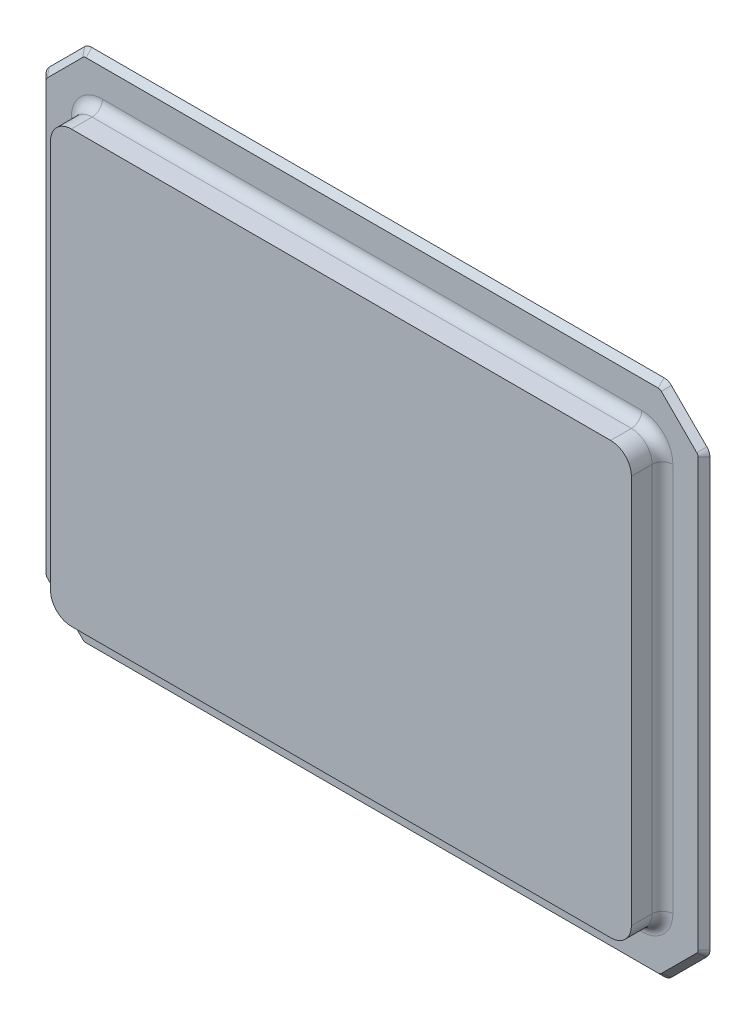
ISO-10303-21;
HEADER;
FILE_DESCRIPTION(('STEP AP214'),'2;1');
FILE_NAME('part.step','',(''),(''),'','','');
FILE_SCHEMA(('AUTOMOTIVE_DESIGN { 1 0 10303 214 1 1 1 1 }'));
ENDSEC;
DATA;
#1=APPLICATION_CONTEXT('core data for automotive mechanical design processes');
#2=APPLICATION_PROTOCOL_DEFINITION('international standard','automotive_design',2000,#1);
#3=PRODUCT_CONTEXT('',#1,'mechanical');
#4=PRODUCT('Part','Part','',(#3));
#5=PRODUCT_RELATED_PRODUCT_CATEGORY('part','',(#4));
#6=PRODUCT_DEFINITION_FORMATION('','',#4);
#7=PRODUCT_DEFINITION_CONTEXT('part definition',#1,'design');
#8=PRODUCT_DEFINITION('design','',#6,#7);
#9=PRODUCT_DEFINITION_SHAPE('','',#8);
#10=(LENGTH_UNIT() NAMED_UNIT(*) SI_UNIT(.MILLI.,.METRE.));
#11=(NAMED_UNIT(*) PLANE_ANGLE_UNIT() SI_UNIT($,.RADIAN.));
#12=(NAMED_UNIT(*) SI_UNIT($,.STERADIAN.) SOLID_ANGLE_UNIT());
#13=UNCERTAINTY_MEASURE_WITH_UNIT(LENGTH_MEASURE(1.E-05),#10,'distance_accuracy_value','');
#14=(GEOMETRIC_REPRESENTATION_CONTEXT(3) GLOBAL_UNCERTAINTY_ASSIGNED_CONTEXT((#13)) GLOBAL_UNIT_ASSIGNED_CONTEXT((#10,
#11,#12)) REPRESENTATION_CONTEXT('',''));
#15=CARTESIAN_POINT('',(0.,0.,0.));
#16=DIRECTION('',(0.,0.,1.));
#17=DIRECTION('',(1.,0.,0.));
#18=AXIS2_PLACEMENT_3D('',#15,#16,#17);
#19=CARTESIAN_POINT('',(1.3,-0.938189666446,0.7));
#20=DIRECTION('',(0.,0.,-1.));
#21=DIRECTION('',(0.707106781186548,-0.707106781186548,0.));
#22=AXIS2_PLACEMENT_3D('',#19,#20,#21);
#23=CYLINDRICAL_SURFACE('',#22,0.1);
#24=CARTESIAN_POINT('',(1.3,-0.938189666446,0.55));
#25=DIRECTION('',(0.,0.,-1.));
#26=DIRECTION('',(0.707106781186548,-0.707106781186548,0.));
#27=AXIS2_PLACEMENT_3D('',#24,#25,#26);
#28=CIRCLE('',#27,0.1);
#29=CARTESIAN_POINT('',(1.4,-0.938189666446,0.55));
#30=VERTEX_POINT('',#29);
#31=CARTESIAN_POINT('',(1.3,-1.038189666446,0.55));
#32=VERTEX_POINT('',#31);
#33=EDGE_CURVE('E452',#30,#32,#28,.T.);
#34=ORIENTED_EDGE('',*,*,#33,.F.);
#35=DIRECTION('',(0.,0.,1.));
#36=VECTOR('',#35,1.);
#37=CARTESIAN_POINT('',(1.4,-0.938189666446,0.7));
#38=LINE('',#37,#36);
#39=CARTESIAN_POINT('',(1.4,-0.938189666446,0.65));
#40=VERTEX_POINT('',#39);
#41=EDGE_CURVE('E334',#30,#40,#38,.T.);
#42=ORIENTED_EDGE('',*,*,#41,.T.);
#43=CARTESIAN_POINT('',(1.3,-0.938189666446,0.65));
#44=DIRECTION('',(0.,0.,1.));
#45=DIRECTION('',(0.707106781186548,-0.707106781186548,0.));
#46=AXIS2_PLACEMENT_3D('',#43,#44,#45);
#47=CIRCLE('',#46,0.1);
#48=CARTESIAN_POINT('',(1.3,-1.038189666446,0.65));
#49=VERTEX_POINT('',#48);
#50=EDGE_CURVE('E437',#49,#40,#47,.T.);
#51=ORIENTED_EDGE('',*,*,#50,.F.);
#52=DIRECTION('',(0.,0.,-1.));
#53=VECTOR('',#52,1.);
#54=CARTESIAN_POINT('',(1.3,-1.038189666446,0.7));
#55=LINE('',#54,#53);
#56=EDGE_CURVE('E20',#49,#32,#55,.T.);
#57=ORIENTED_EDGE('',*,*,#56,.T.);
#58=EDGE_LOOP('',(#34,#42,#51,#57));
#59=FACE_BOUND('',#58,.T.);
#60=ADVANCED_FACE('F17',(#59),#23,.T.);
#61=CARTESIAN_POINT('',(-1.4,-1.038189666446,0.7));
#62=DIRECTION('',(-1.,0.,0.));
#63=DIRECTION('',(0.,0.,1.));
#64=AXIS2_PLACEMENT_3D('',#61,#62,#63);
#65=PLANE('',#64);
#66=DIRECTION('',(0.,1.,0.));
#67=VECTOR('',#66,1.);
#68=CARTESIAN_POINT('',(-1.4,-0.519094833223,0.55));
#69=LINE('',#68,#67);
#70=CARTESIAN_POINT('',(-1.4,-0.938189666446,0.55));
#71=VERTEX_POINT('',#70);
#72=CARTESIAN_POINT('',(-1.4,0.938189666446,0.55));
#73=VERTEX_POINT('',#72);
#74=EDGE_CURVE('E322',#71,#73,#69,.T.);
#75=ORIENTED_EDGE('',*,*,#74,.F.);
#76=DIRECTION('',(0.,0.,-1.));
#77=VECTOR('',#76,1.);
#78=CARTESIAN_POINT('',(-1.4,-0.938189666446,0.7));
#79=LINE('',#78,#77);
#80=CARTESIAN_POINT('',(-1.4,-0.938189666446,0.65));
#81=VERTEX_POINT('',#80);
#82=EDGE_CURVE('E11',#81,#71,#79,.T.);
#83=ORIENTED_EDGE('',*,*,#82,.F.);
#84=DIRECTION('',(0.,-1.,0.));
#85=VECTOR('',#84,1.);
#86=CARTESIAN_POINT('',(-1.4,-0.519094833223,0.65));
#87=LINE('',#86,#85);
#88=CARTESIAN_POINT('',(-1.4,0.938189666446,0.65));
#89=VERTEX_POINT('',#88);
#90=EDGE_CURVE('E416',#89,#81,#87,.T.);
#91=ORIENTED_EDGE('',*,*,#90,.F.);
#92=DIRECTION('',(0.,0.,1.));
#93=VECTOR('',#92,1.);
#94=CARTESIAN_POINT('',(-1.4,0.938189666446,0.7));
#95=LINE('',#94,#93);
#96=EDGE_CURVE('E479',#73,#89,#95,.T.);
#97=ORIENTED_EDGE('',*,*,#96,.F.);
#98=EDGE_LOOP('',(#75,#83,#91,#97));
#99=FACE_BOUND('',#98,.T.);
#100=ADVANCED_FACE('F602',(#99),#65,.T.);
#101=CARTESIAN_POINT('',(-1.3,-0.938189666446,0.7));
#102=DIRECTION('',(0.,0.,-1.));
#103=DIRECTION('',(-0.707106781186548,-0.707106781186548,0.));
#104=AXIS2_PLACEMENT_3D('',#101,#102,#103);
#105=CYLINDRICAL_SURFACE('',#104,0.1);
#106=CARTESIAN_POINT('',(-1.3,-0.938189666446,0.55));
#107=DIRECTION('',(0.,0.,-1.));
#108=DIRECTION('',(-0.707106781186548,-0.707106781186548,0.));
#109=AXIS2_PLACEMENT_3D('',#106,#107,#108);
#110=CIRCLE('',#109,0.1);
#111=CARTESIAN_POINT('',(-1.3,-1.038189666446,0.55));
#112=VERTEX_POINT('',#111);
#113=EDGE_CURVE('E321',#112,#71,#110,.T.);
#114=ORIENTED_EDGE('',*,*,#113,.F.);
#115=DIRECTION('',(0.,0.,1.));
#116=VECTOR('',#115,1.);
#117=CARTESIAN_POINT('',(-1.3,-1.038189666446,0.7));
#118=LINE('',#117,#116);
#119=CARTESIAN_POINT('',(-1.3,-1.038189666446,0.65));
#120=VERTEX_POINT('',#119);
#121=EDGE_CURVE('E26',#112,#120,#118,.T.);
#122=ORIENTED_EDGE('',*,*,#121,.T.);
#123=CARTESIAN_POINT('',(-1.3,-0.938189666446,0.65));
#124=DIRECTION('',(0.,0.,1.));
#125=DIRECTION('',(-0.707106781186548,-0.707106781186548,0.));
#126=AXIS2_PLACEMENT_3D('',#123,#124,#125);
#127=CIRCLE('',#126,0.1);
#128=EDGE_CURVE('E420',#81,#120,#127,.T.);
#129=ORIENTED_EDGE('',*,*,#128,.F.);
#130=ORIENTED_EDGE('',*,*,#82,.T.);
#131=EDGE_LOOP('',(#114,#122,#129,#130));
#132=FACE_BOUND('',#131,.T.);
#133=ADVANCED_FACE('F627',(#132),#105,.T.);
#134=CARTESIAN_POINT('',(1.4,-1.038189666446,0.7));
#135=DIRECTION('',(0.,-1.,0.));
#136=DIRECTION('',(0.,0.,-1.));
#137=AXIS2_PLACEMENT_3D('',#134,#135,#136);
#138=PLANE('',#137);
#139=DIRECTION('',(-1.,0.,0.));
#140=VECTOR('',#139,1.);
#141=CARTESIAN_POINT('',(0.7,-1.038189666446,0.55));
#142=LINE('',#141,#140);
#143=EDGE_CURVE('E504',#32,#112,#142,.T.);
#144=ORIENTED_EDGE('',*,*,#143,.F.);
#145=ORIENTED_EDGE('',*,*,#56,.F.);
#146=DIRECTION('',(1.,0.,0.));
#147=VECTOR('',#146,1.);
#148=CARTESIAN_POINT('',(0.7,-1.038189666446,0.65));
#149=LINE('',#148,#147);
#150=EDGE_CURVE('E429',#120,#49,#149,.T.);
#151=ORIENTED_EDGE('',*,*,#150,.F.);
#152=ORIENTED_EDGE('',*,*,#121,.F.);
#153=EDGE_LOOP('',(#144,#145,#151,#152));
#154=FACE_BOUND('',#153,.T.);
#155=ADVANCED_FACE('F631',(#154),#138,.T.);
#156=CARTESIAN_POINT('',(-1.3,0.938189666446,0.7));
#157=DIRECTION('',(0.,0.,-1.));
#158=DIRECTION('',(-0.707106781186548,0.707106781186548,0.));
#159=AXIS2_PLACEMENT_3D('',#156,#157,#158);
#160=CYLINDRICAL_SURFACE('',#159,0.1);
#161=CARTESIAN_POINT('',(-1.3,0.938189666446,0.55));
#162=DIRECTION('',(0.,0.,-1.));
#163=DIRECTION('',(-0.707106781186548,0.707106781186548,0.));
#164=AXIS2_PLACEMENT_3D('',#161,#162,#163);
#165=CIRCLE('',#164,0.1);
#166=CARTESIAN_POINT('',(-1.3,1.038189666446,0.55));
#167=VERTEX_POINT('',#166);
#168=EDGE_CURVE('E398',#73,#167,#165,.T.);
#169=ORIENTED_EDGE('',*,*,#168,.F.);
#170=ORIENTED_EDGE('',*,*,#96,.T.);
#171=CARTESIAN_POINT('',(-1.3,0.938189666446,0.65));
#172=DIRECTION('',(0.,0.,1.));
#173=DIRECTION('',(-0.707106781186548,0.707106781186548,0.));
#174=AXIS2_PLACEMENT_3D('',#171,#172,#173);
#175=CIRCLE('',#174,0.1);
#176=CARTESIAN_POINT('',(-1.3,1.038189666446,0.65));
#177=VERTEX_POINT('',#176);
#178=EDGE_CURVE('E397',#177,#89,#175,.T.);
#179=ORIENTED_EDGE('',*,*,#178,.F.);
#180=DIRECTION('',(0.,0.,-1.));
#181=VECTOR('',#180,1.);
#182=CARTESIAN_POINT('',(-1.3,1.038189666446,0.7));
#183=LINE('',#182,#181);
#184=EDGE_CURVE('E482',#177,#167,#183,.T.);
#185=ORIENTED_EDGE('',*,*,#184,.T.);
#186=EDGE_LOOP('',(#169,#170,#179,#185));
#187=FACE_BOUND('',#186,.T.);
#188=ADVANCED_FACE('F582',(#187),#160,.T.);
#189=CARTESIAN_POINT('',(-1.4,1.038189666446,0.7));
#190=DIRECTION('',(0.,1.,0.));
#191=DIRECTION('',(1.,0.,0.));
#192=AXIS2_PLACEMENT_3D('',#189,#190,#191);
#193=PLANE('',#192);
#194=DIRECTION('',(1.,0.,0.));
#195=VECTOR('',#194,1.);
#196=CARTESIAN_POINT('',(-0.7,1.038189666446,0.55));
#197=LINE('',#196,#195);
#198=CARTESIAN_POINT('',(1.3,1.038189666446,0.55));
#199=VERTEX_POINT('',#198);
#200=EDGE_CURVE('E374',#167,#199,#197,.T.);
#201=ORIENTED_EDGE('',*,*,#200,.F.);
#202=ORIENTED_EDGE('',*,*,#184,.F.);
#203=DIRECTION('',(-1.,0.,0.));
#204=VECTOR('',#203,1.);
#205=CARTESIAN_POINT('',(-0.7,1.038189666446,0.65));
#206=LINE('',#205,#204);
#207=CARTESIAN_POINT('',(1.3,1.038189666446,0.65));
#208=VERTEX_POINT('',#207);
#209=EDGE_CURVE('E393',#208,#177,#206,.T.);
#210=ORIENTED_EDGE('',*,*,#209,.F.);
#211=DIRECTION('',(0.,0.,1.));
#212=VECTOR('',#211,1.);
#213=CARTESIAN_POINT('',(1.3,1.038189666446,0.7));
#214=LINE('',#213,#212);
#215=EDGE_CURVE('E39',#199,#208,#214,.T.);
#216=ORIENTED_EDGE('',*,*,#215,.F.);
#217=EDGE_LOOP('',(#201,#202,#210,#216));
#218=FACE_BOUND('',#217,.T.);
#219=ADVANCED_FACE('F583',(#218),#193,.T.);
#220=CARTESIAN_POINT('',(1.3,0.938189666446,0.7));
#221=DIRECTION('',(0.,0.,-1.));
#222=DIRECTION('',(0.707106781186548,0.707106781186548,0.));
#223=AXIS2_PLACEMENT_3D('',#220,#221,#222);
#224=CYLINDRICAL_SURFACE('',#223,0.1);
#225=CARTESIAN_POINT('',(1.3,0.938189666446,0.55));
#226=DIRECTION('',(0.,0.,-1.));
#227=DIRECTION('',(0.707106781186548,0.707106781186548,0.));
#228=AXIS2_PLACEMENT_3D('',#225,#226,#227);
#229=CIRCLE('',#228,0.1);
#230=CARTESIAN_POINT('',(1.4,0.938189666446,0.55));
#231=VERTEX_POINT('',#230);
#232=EDGE_CURVE('E483',#199,#231,#229,.T.);
#233=ORIENTED_EDGE('',*,*,#232,.F.);
#234=ORIENTED_EDGE('',*,*,#215,.T.);
#235=CARTESIAN_POINT('',(1.3,0.938189666446,0.65));
#236=DIRECTION('',(0.,0.,1.));
#237=DIRECTION('',(0.707106781186548,0.707106781186548,0.));
#238=AXIS2_PLACEMENT_3D('',#235,#236,#237);
#239=CIRCLE('',#238,0.1);
#240=CARTESIAN_POINT('',(1.4,0.938189666446,0.65));
#241=VERTEX_POINT('',#240);
#242=EDGE_CURVE('E389',#241,#208,#239,.T.);
#243=ORIENTED_EDGE('',*,*,#242,.F.);
#244=DIRECTION('',(0.,0.,-1.));
#245=VECTOR('',#244,1.);
#246=CARTESIAN_POINT('',(1.4,0.938189666446,0.7));
#247=LINE('',#246,#245);
#248=EDGE_CURVE('E49',#241,#231,#247,.T.);
#249=ORIENTED_EDGE('',*,*,#248,.T.);
#250=EDGE_LOOP('',(#233,#234,#243,#249));
#251=FACE_BOUND('',#250,.T.);
#252=ADVANCED_FACE('F608',(#251),#224,.T.);
#253=CARTESIAN_POINT('',(1.4,1.038189666446,0.7));
#254=DIRECTION('',(1.,0.,0.));
#255=DIRECTION('',(0.,1.,0.));
#256=AXIS2_PLACEMENT_3D('',#253,#254,#255);
#257=PLANE('',#256);
#258=DIRECTION('',(0.,-1.,0.));
#259=VECTOR('',#258,1.);
#260=CARTESIAN_POINT('',(1.4,0.519094833223,0.55));
#261=LINE('',#260,#259);
#262=EDGE_CURVE('E451',#231,#30,#261,.T.);
#263=ORIENTED_EDGE('',*,*,#262,.F.);
#264=ORIENTED_EDGE('',*,*,#248,.F.);
#265=DIRECTION('',(0.,1.,0.));
#266=VECTOR('',#265,1.);
#267=CARTESIAN_POINT('',(1.4,0.519094833223,0.65));
#268=LINE('',#267,#266);
#269=EDGE_CURVE('E290',#40,#241,#268,.T.);
#270=ORIENTED_EDGE('',*,*,#269,.F.);
#271=ORIENTED_EDGE('',*,*,#41,.F.);
#272=EDGE_LOOP('',(#263,#264,#270,#271));
#273=FACE_BOUND('',#272,.T.);
#274=ADVANCED_FACE('F635',(#273),#257,.T.);
#275=CARTESIAN_POINT('',(-0.7,1.088189666446,0.55));
#276=DIRECTION('',(-1.,0.,0.));
#277=DIRECTION('',(0.,-0.707106781186548,-0.707106781186548));
#278=AXIS2_PLACEMENT_3D('',#275,#276,#277);
#279=CYLINDRICAL_SURFACE('',#278,0.05);
#280=CARTESIAN_POINT('',(-1.3,1.088189666446,0.55));
#281=DIRECTION('',(1.,0.,0.));
#282=DIRECTION('',(0.,-1.,0.));
#283=AXIS2_PLACEMENT_3D('',#280,#281,#282);
#284=CIRCLE('',#283,0.05);
#285=CARTESIAN_POINT('',(-1.3,1.088189666446,0.5));
#286=VERTEX_POINT('',#285);
#287=EDGE_CURVE('E351',#167,#286,#284,.T.);
#288=ORIENTED_EDGE('',*,*,#287,.F.);
#289=ORIENTED_EDGE('',*,*,#200,.T.);
#290=CARTESIAN_POINT('',(1.3,1.088189666446,0.55));
#291=DIRECTION('',(-1.,0.,0.));
#292=DIRECTION('',(0.,0.,-1.));
#293=AXIS2_PLACEMENT_3D('',#290,#291,#292);
#294=CIRCLE('',#293,0.05);
#295=CARTESIAN_POINT('',(1.3,1.088189666446,0.5));
#296=VERTEX_POINT('',#295);
#297=EDGE_CURVE('E486',#296,#199,#294,.T.);
#298=ORIENTED_EDGE('',*,*,#297,.F.);
#299=DIRECTION('',(-1.,0.,0.));
#300=VECTOR('',#299,1.);
#301=CARTESIAN_POINT('',(-0.7,1.088189666446,0.5));
#302=LINE('',#301,#300);
#303=EDGE_CURVE('E491',#296,#286,#302,.T.);
#304=ORIENTED_EDGE('',*,*,#303,.T.);
#305=EDGE_LOOP('',(#288,#289,#298,#304));
#306=FACE_BOUND('',#305,.T.);
#307=ADVANCED_FACE('F588',(#306),#279,.F.);
#308=CARTESIAN_POINT('',(1.3,0.938189666446,0.55));
#309=DIRECTION('',(0.,0.,1.));
#310=DIRECTION('',(1.,0.,0.));
#311=AXIS2_PLACEMENT_3D('',#308,#309,#310);
#312=TOROIDAL_SURFACE('',#311,0.15,0.05);
#313=ORIENTED_EDGE('',*,*,#297,.T.);
#314=ORIENTED_EDGE('',*,*,#232,.T.);
#315=CARTESIAN_POINT('',(1.45,0.938189666446,0.55));
#316=DIRECTION('',(0.,1.,0.));
#317=DIRECTION('',(0.,0.,-1.));
#318=AXIS2_PLACEMENT_3D('',#315,#316,#317);
#319=CIRCLE('',#318,0.05);
#320=CARTESIAN_POINT('',(1.45,0.938189666446,0.5));
#321=VERTEX_POINT('',#320);
#322=EDGE_CURVE('E447',#321,#231,#319,.T.);
#323=ORIENTED_EDGE('',*,*,#322,.F.);
#324=CARTESIAN_POINT('',(1.3,0.938189666446,0.5));
#325=DIRECTION('',(0.,0.,1.));
#326=DIRECTION('',(0.707106781186548,0.707106781186548,0.));
#327=AXIS2_PLACEMENT_3D('',#324,#325,#326);
#328=CIRCLE('',#327,0.15);
#329=EDGE_CURVE('E487',#321,#296,#328,.T.);
#330=ORIENTED_EDGE('',*,*,#329,.T.);
#331=EDGE_LOOP('',(#313,#314,#323,#330));
#332=FACE_BOUND('',#331,.T.);
#333=ADVANCED_FACE('F611',(#332),#312,.F.);
#334=CARTESIAN_POINT('',(1.45,0.519094833223,0.55));
#335=DIRECTION('',(0.,1.,0.));
#336=DIRECTION('',(-0.707106781186548,0.,-0.707106781186548));
#337=AXIS2_PLACEMENT_3D('',#334,#335,#336);
#338=CYLINDRICAL_SURFACE('',#337,0.05);
#339=ORIENTED_EDGE('',*,*,#322,.T.);
#340=ORIENTED_EDGE('',*,*,#262,.T.);
#341=CARTESIAN_POINT('',(1.45,-0.938189666446,0.55));
#342=DIRECTION('',(0.,1.,0.));
#343=DIRECTION('',(0.,0.,-1.));
#344=AXIS2_PLACEMENT_3D('',#341,#342,#343);
#345=CIRCLE('',#344,0.05);
#346=CARTESIAN_POINT('',(1.45,-0.938189666446,0.5));
#347=VERTEX_POINT('',#346);
#348=EDGE_CURVE('E525',#347,#30,#345,.T.);
#349=ORIENTED_EDGE('',*,*,#348,.F.);
#350=DIRECTION('',(0.,1.,0.));
#351=VECTOR('',#350,1.);
#352=CARTESIAN_POINT('',(1.45,0.519094833223,0.5));
#353=LINE('',#352,#351);
#354=EDGE_CURVE('E328',#347,#321,#353,.T.);
#355=ORIENTED_EDGE('',*,*,#354,.T.);
#356=EDGE_LOOP('',(#339,#340,#349,#355));
#357=FACE_BOUND('',#356,.T.);
#358=ADVANCED_FACE('F615',(#357),#338,.F.);
#359=CARTESIAN_POINT('',(1.3,-0.938189666446,0.55));
#360=DIRECTION('',(0.,0.,1.));
#361=DIRECTION('',(1.,0.,0.));
#362=AXIS2_PLACEMENT_3D('',#359,#360,#361);
#363=TOROIDAL_SURFACE('',#362,0.15,0.05);
#364=ORIENTED_EDGE('',*,*,#348,.T.);
#365=ORIENTED_EDGE('',*,*,#33,.T.);
#366=CARTESIAN_POINT('',(1.3,-1.088189666446,0.55));
#367=DIRECTION('',(1.,0.,0.));
#368=DIRECTION('',(0.,0.,-1.));
#369=AXIS2_PLACEMENT_3D('',#366,#367,#368);
#370=CIRCLE('',#369,0.05);
#371=CARTESIAN_POINT('',(1.3,-1.088189666446,0.5));
#372=VERTEX_POINT('',#371);
#373=EDGE_CURVE('E350',#372,#32,#370,.T.);
#374=ORIENTED_EDGE('',*,*,#373,.F.);
#375=CARTESIAN_POINT('',(1.3,-0.938189666446,0.5));
#376=DIRECTION('',(0.,0.,1.));
#377=DIRECTION('',(0.707106781186548,-0.707106781186548,0.));
#378=AXIS2_PLACEMENT_3D('',#375,#376,#377);
#379=CIRCLE('',#378,0.15);
#380=EDGE_CURVE('E323',#372,#347,#379,.T.);
#381=ORIENTED_EDGE('',*,*,#380,.T.);
#382=EDGE_LOOP('',(#364,#365,#374,#381));
#383=FACE_BOUND('',#382,.T.);
#384=ADVANCED_FACE('F619',(#383),#363,.F.);
#385=CARTESIAN_POINT('',(0.7,-1.088189666446,0.55));
#386=DIRECTION('',(1.,0.,0.));
#387=DIRECTION('',(0.,0.707106781186548,-0.707106781186548));
#388=AXIS2_PLACEMENT_3D('',#385,#386,#387);
#389=CYLINDRICAL_SURFACE('',#388,0.05);
#390=ORIENTED_EDGE('',*,*,#373,.T.);
#391=ORIENTED_EDGE('',*,*,#143,.T.);
#392=CARTESIAN_POINT('',(-1.3,-1.088189666446,0.55));
#393=DIRECTION('',(1.,0.,0.));
#394=DIRECTION('',(0.,0.,-1.));
#395=AXIS2_PLACEMENT_3D('',#392,#393,#394);
#396=CIRCLE('',#395,0.05);
#397=CARTESIAN_POINT('',(-1.3,-1.088189666446,0.5));
#398=VERTEX_POINT('',#397);
#399=EDGE_CURVE('E317',#398,#112,#396,.T.);
#400=ORIENTED_EDGE('',*,*,#399,.F.);
#401=DIRECTION('',(1.,0.,0.));
#402=VECTOR('',#401,1.);
#403=CARTESIAN_POINT('',(0.7,-1.088189666446,0.5));
#404=LINE('',#403,#402);
#405=EDGE_CURVE('E327',#398,#372,#404,.T.);
#406=ORIENTED_EDGE('',*,*,#405,.T.);
#407=EDGE_LOOP('',(#390,#391,#400,#406));
#408=FACE_BOUND('',#407,.T.);
#409=ADVANCED_FACE('F622',(#408),#389,.F.);
#410=CARTESIAN_POINT('',(-1.3,-0.938189666446,0.55));
#411=DIRECTION('',(0.,0.,1.));
#412=DIRECTION('',(1.,0.,0.));
#413=AXIS2_PLACEMENT_3D('',#410,#411,#412);
#414=TOROIDAL_SURFACE('',#413,0.15,0.05);
#415=ORIENTED_EDGE('',*,*,#399,.T.);
#416=ORIENTED_EDGE('',*,*,#113,.T.);
#417=CARTESIAN_POINT('',(-1.45,-0.938189666446,0.55));
#418=DIRECTION('',(0.,-1.,0.));
#419=DIRECTION('',(0.,0.,-1.));
#420=AXIS2_PLACEMENT_3D('',#417,#418,#419);
#421=CIRCLE('',#420,0.05);
#422=CARTESIAN_POINT('',(-1.45,-0.938189666446,0.5));
#423=VERTEX_POINT('',#422);
#424=EDGE_CURVE('E402',#423,#71,#421,.T.);
#425=ORIENTED_EDGE('',*,*,#424,.F.);
#426=CARTESIAN_POINT('',(-1.3,-0.938189666446,0.5));
#427=DIRECTION('',(0.,0.,1.));
#428=DIRECTION('',(-0.707106781186548,-0.707106781186548,0.));
#429=AXIS2_PLACEMENT_3D('',#426,#427,#428);
#430=CIRCLE('',#429,0.15);
#431=EDGE_CURVE('E363',#423,#398,#430,.T.);
#432=ORIENTED_EDGE('',*,*,#431,.T.);
#433=EDGE_LOOP('',(#415,#416,#425,#432));
#434=FACE_BOUND('',#433,.T.);
#435=ADVANCED_FACE('F625',(#434),#414,.F.);
#436=CARTESIAN_POINT('',(-1.45,-0.519094833223,0.55));
#437=DIRECTION('',(0.,-1.,0.));
#438=DIRECTION('',(0.707106781186548,0.,-0.707106781186548));
#439=AXIS2_PLACEMENT_3D('',#436,#437,#438);
#440=CYLINDRICAL_SURFACE('',#439,0.05);
#441=ORIENTED_EDGE('',*,*,#424,.T.);
#442=ORIENTED_EDGE('',*,*,#74,.T.);
#443=CARTESIAN_POINT('',(-1.45,0.938189666446,0.55));
#444=DIRECTION('',(0.,-1.,0.));
#445=DIRECTION('',(0.,0.,-1.));
#446=AXIS2_PLACEMENT_3D('',#443,#444,#445);
#447=CIRCLE('',#446,0.05);
#448=CARTESIAN_POINT('',(-1.45,0.938189666446,0.5));
#449=VERTEX_POINT('',#448);
#450=EDGE_CURVE('E354',#449,#73,#447,.T.);
#451=ORIENTED_EDGE('',*,*,#450,.F.);
#452=DIRECTION('',(0.,-1.,0.));
#453=VECTOR('',#452,1.);
#454=CARTESIAN_POINT('',(-1.45,-0.519094833223,0.5));
#455=LINE('',#454,#453);
#456=EDGE_CURVE('E355',#449,#423,#455,.T.);
#457=ORIENTED_EDGE('',*,*,#456,.T.);
#458=EDGE_LOOP('',(#441,#442,#451,#457));
#459=FACE_BOUND('',#458,.T.);
#460=ADVANCED_FACE('F599',(#459),#440,.F.);
#461=CARTESIAN_POINT('',(-1.3,0.938189666446,0.55));
#462=DIRECTION('',(0.,0.,1.));
#463=DIRECTION('',(1.,0.,0.));
#464=AXIS2_PLACEMENT_3D('',#461,#462,#463);
#465=TOROIDAL_SURFACE('',#464,0.15,0.05);
#466=ORIENTED_EDGE('',*,*,#287,.T.);
#467=CARTESIAN_POINT('',(-1.3,0.938189666446,0.5));
#468=DIRECTION('',(0.,0.,1.));
#469=DIRECTION('',(-0.707106781186548,0.707106781186548,0.));
#470=AXIS2_PLACEMENT_3D('',#467,#468,#469);
#471=CIRCLE('',#470,0.15);
#472=EDGE_CURVE('E545',#286,#449,#471,.T.);
#473=ORIENTED_EDGE('',*,*,#472,.T.);
#474=ORIENTED_EDGE('',*,*,#450,.T.);
#475=ORIENTED_EDGE('',*,*,#168,.T.);
#476=EDGE_LOOP('',(#466,#473,#474,#475));
#477=FACE_BOUND('',#476,.T.);
#478=ADVANCED_FACE('F587',(#477),#465,.F.);
#479=CARTESIAN_POINT('',(0.,0.,0.5));
#480=DIRECTION('',(0.,0.,-1.));
#481=DIRECTION('',(0.,-1.,0.));
#482=AXIS2_PLACEMENT_3D('',#479,#480,#481);
#483=PLANE('',#482);
#484=ORIENTED_EDGE('',*,*,#472,.F.);
#485=ORIENTED_EDGE('',*,*,#303,.F.);
#486=ORIENTED_EDGE('',*,*,#329,.F.);
#487=ORIENTED_EDGE('',*,*,#354,.F.);
#488=ORIENTED_EDGE('',*,*,#380,.F.);
#489=ORIENTED_EDGE('',*,*,#405,.F.);
#490=ORIENTED_EDGE('',*,*,#431,.F.);
#491=ORIENTED_EDGE('',*,*,#456,.F.);
#492=EDGE_LOOP('',(#484,#485,#486,#487,#488,#489,#490,#491));
#493=FACE_BOUND('',#492,.T.);
#494=DIRECTION('',(0.707106781186548,-0.707106781186548,0.));
#495=VECTOR('',#494,1.);
#496=CARTESIAN_POINT('',(1.392347456736,1.217347456736,0.5));
#497=LINE('',#496,#495);
#498=CARTESIAN_POINT('',(1.394492117677,1.215202795796,0.5));
#499=VERTEX_POINT('',#498);
#500=CARTESIAN_POINT('',(1.565202795796,1.044492117677,0.5));
#501=VERTEX_POINT('',#500);
#502=EDGE_CURVE('E279',#499,#501,#497,.T.);
#503=ORIENTED_EDGE('',*,*,#502,.F.);
#504=CARTESIAN_POINT('',(1.379289321881,1.2,0.5));
#505=DIRECTION('',(0.,0.,-1.));
#506=DIRECTION('',(0.382683432365114,0.923879532511276,0.));
#507=AXIS2_PLACEMENT_3D('',#504,#505,#506);
#508=CIRCLE('',#507,0.0215);
#509=CARTESIAN_POINT('',(1.379289321881,1.2215,0.5));
#510=VERTEX_POINT('',#509);
#511=EDGE_CURVE('E475',#510,#499,#508,.T.);
#512=ORIENTED_EDGE('',*,*,#511,.F.);
#513=DIRECTION('',(1.,0.,0.));
#514=VECTOR('',#513,1.);
#515=CARTESIAN_POINT('',(0.8,1.2215,0.5));
#516=LINE('',#515,#514);
#517=CARTESIAN_POINT('',(-1.379289321881,1.2215,0.5));
#518=VERTEX_POINT('',#517);
#519=EDGE_CURVE('E467',#518,#510,#516,.T.);
#520=ORIENTED_EDGE('',*,*,#519,.F.);
#521=CARTESIAN_POINT('',(-1.379289321881,1.2,0.5));
#522=DIRECTION('',(0.,0.,-1.));
#523=DIRECTION('',(-0.382683432365114,0.923879532511276,0.));
#524=AXIS2_PLACEMENT_3D('',#521,#522,#523);
#525=CIRCLE('',#524,0.0215);
#526=CARTESIAN_POINT('',(-1.394492117677,1.215202795796,0.5));
#527=VERTEX_POINT('',#526);
#528=EDGE_CURVE('E384',#527,#518,#525,.T.);
#529=ORIENTED_EDGE('',*,*,#528,.F.);
#530=DIRECTION('',(0.707106781186548,0.707106781186548,0.));
#531=VECTOR('',#530,1.);
#532=CARTESIAN_POINT('',(-1.392347456736,1.217347456736,0.5));
#533=LINE('',#532,#531);
#534=CARTESIAN_POINT('',(-1.565202795796,1.044492117677,0.5));
#535=VERTEX_POINT('',#534);
#536=EDGE_CURVE('E385',#535,#527,#533,.T.);
#537=ORIENTED_EDGE('',*,*,#536,.F.);
#538=CARTESIAN_POINT('',(-1.55,1.029289321881,0.5));
#539=DIRECTION('',(0.,0.,-1.));
#540=DIRECTION('',(-0.923879532511276,0.382683432365114,0.));
#541=AXIS2_PLACEMENT_3D('',#538,#539,#540);
#542=CIRCLE('',#541,0.0215);
#543=CARTESIAN_POINT('',(-1.5715,1.029289321881,0.5));
#544=VERTEX_POINT('',#543);
#545=EDGE_CURVE('E367',#544,#535,#542,.T.);
#546=ORIENTED_EDGE('',*,*,#545,.F.);
#547=DIRECTION('',(0.,1.,0.));
#548=VECTOR('',#547,1.);
#549=CARTESIAN_POINT('',(-1.5715,0.625,0.5));
#550=LINE('',#549,#548);
#551=CARTESIAN_POINT('',(-1.5715,-1.029289321881,0.5));
#552=VERTEX_POINT('',#551);
#553=EDGE_CURVE('E368',#552,#544,#550,.T.);
#554=ORIENTED_EDGE('',*,*,#553,.F.);
#555=CARTESIAN_POINT('',(-1.55,-1.029289321881,0.5));
#556=DIRECTION('',(0.,0.,-1.));
#557=DIRECTION('',(-0.923879532511276,-0.382683432365114,0.));
#558=AXIS2_PLACEMENT_3D('',#555,#556,#557);
#559=CIRCLE('',#558,0.0215);
#560=CARTESIAN_POINT('',(-1.565202795796,-1.044492117677,0.5));
#561=VERTEX_POINT('',#560);
#562=EDGE_CURVE('E517',#561,#552,#559,.T.);
#563=ORIENTED_EDGE('',*,*,#562,.F.);
#564=DIRECTION('',(-0.707106781186548,0.707106781186548,0.));
#565=VECTOR('',#564,1.);
#566=CARTESIAN_POINT('',(-1.392347456736,-1.217347456736,0.5));
#567=LINE('',#566,#565);
#568=CARTESIAN_POINT('',(-1.394492117677,-1.215202795796,0.5));
#569=VERTEX_POINT('',#568);
#570=EDGE_CURVE('E510',#569,#561,#567,.T.);
#571=ORIENTED_EDGE('',*,*,#570,.F.);
#572=CARTESIAN_POINT('',(-1.379289321881,-1.2,0.5));
#573=DIRECTION('',(0.,0.,-1.));
#574=DIRECTION('',(-0.382683432365114,-0.923879532511276,0.));
#575=AXIS2_PLACEMENT_3D('',#572,#573,#574);
#576=CIRCLE('',#575,0.0215);
#577=CARTESIAN_POINT('',(-1.379289321881,-1.2215,0.5));
#578=VERTEX_POINT('',#577);
#579=EDGE_CURVE('E403',#578,#569,#576,.T.);
#580=ORIENTED_EDGE('',*,*,#579,.F.);
#581=DIRECTION('',(-1.,0.,0.));
#582=VECTOR('',#581,1.);
#583=CARTESIAN_POINT('',(-0.8,-1.2215,0.5));
#584=LINE('',#583,#582);
#585=CARTESIAN_POINT('',(1.379289321881,-1.2215,0.5));
#586=VERTEX_POINT('',#585);
#587=EDGE_CURVE('E430',#586,#578,#584,.T.);
#588=ORIENTED_EDGE('',*,*,#587,.F.);
#589=CARTESIAN_POINT('',(1.379289321881,-1.2,0.5));
#590=DIRECTION('',(0.,0.,-1.));
#591=DIRECTION('',(0.382683432365114,-0.923879532511276,0.));
#592=AXIS2_PLACEMENT_3D('',#589,#590,#591);
#593=CIRCLE('',#592,0.0215);
#594=CARTESIAN_POINT('',(1.394492117677,-1.215202795796,0.5));
#595=VERTEX_POINT('',#594);
#596=EDGE_CURVE('E337',#595,#586,#593,.T.);
#597=ORIENTED_EDGE('',*,*,#596,.F.);
#598=DIRECTION('',(-0.707106781186548,-0.707106781186548,0.));
#599=VECTOR('',#598,1.);
#600=CARTESIAN_POINT('',(1.392347456736,-1.217347456736,0.5));
#601=LINE('',#600,#599);
#602=CARTESIAN_POINT('',(1.565202795796,-1.044492117677,0.5));
#603=VERTEX_POINT('',#602);
#604=EDGE_CURVE('E478',#603,#595,#601,.T.);
#605=ORIENTED_EDGE('',*,*,#604,.F.);
#606=CARTESIAN_POINT('',(1.55,-1.029289321881,0.5));
#607=DIRECTION('',(0.,0.,-1.));
#608=DIRECTION('',(0.923879532511276,-0.382683432365114,0.));
#609=AXIS2_PLACEMENT_3D('',#606,#607,#608);
#610=CIRCLE('',#609,0.0215);
#611=CARTESIAN_POINT('',(1.5715,-1.029289321881,0.5));
#612=VERTEX_POINT('',#611);
#613=EDGE_CURVE('E463',#612,#603,#610,.T.);
#614=ORIENTED_EDGE('',*,*,#613,.F.);
#615=DIRECTION('',(0.,-1.,0.));
#616=VECTOR('',#615,1.);
#617=CARTESIAN_POINT('',(1.5715,-0.625,0.5));
#618=LINE('',#617,#616);
#619=CARTESIAN_POINT('',(1.5715,1.029289321881,0.5));
#620=VERTEX_POINT('',#619);
#621=EDGE_CURVE('E457',#620,#612,#618,.T.);
#622=ORIENTED_EDGE('',*,*,#621,.F.);
#623=CARTESIAN_POINT('',(1.55,1.029289321881,0.5));
#624=DIRECTION('',(0.,0.,-1.));
#625=DIRECTION('',(0.923879532511276,0.382683432365114,0.));
#626=AXIS2_PLACEMENT_3D('',#623,#624,#625);
#627=CIRCLE('',#626,0.0215);
#628=EDGE_CURVE('E275',#501,#620,#627,.T.);
#629=ORIENTED_EDGE('',*,*,#628,.F.);
#630=EDGE_LOOP('',(#503,#512,#520,#529,#537,#546,#554,#563,#571,#580,#588,#597,#605,#614,#622,#629));
#631=FACE_BOUND('',#630,.T.);
#632=ADVANCED_FACE('F594',(#493,#631),#483,.F.);
#633=CARTESIAN_POINT('',(1.379289321881,1.2,0.48575));
#634=DIRECTION('',(0.,0.,-1.));
#635=DIRECTION('',(0.382683432365114,0.923879532511277,0.));
#636=AXIS2_PLACEMENT_3D('',#633,#634,#635);
#637=CONICAL_SURFACE('',#636,0.03575,0.7853981634);
#638=DIRECTION('',(-0.49999999999984,-0.49999999999984,0.707106781186774));
#639=VECTOR('',#638,1.);
#640=CARTESIAN_POINT('',(1.414644660941,1.235355339059,0.4715));
#641=LINE('',#640,#639);
#642=CARTESIAN_POINT('',(1.414644660941,1.235355339059,0.4715));
#643=VERTEX_POINT('',#642);
#644=EDGE_CURVE('E412',#643,#499,#641,.T.);
#645=ORIENTED_EDGE('',*,*,#644,.F.);
#646=CARTESIAN_POINT('',(1.379289321881,1.2,0.4715));
#647=DIRECTION('',(0.,0.,1.));
#648=DIRECTION('',(0.382683432365114,0.923879532511277,0.));
#649=AXIS2_PLACEMENT_3D('',#646,#647,#648);
#650=CIRCLE('',#649,0.05);
#651=CARTESIAN_POINT('',(1.379289321881,1.25,0.4715));
#652=VERTEX_POINT('',#651);
#653=EDGE_CURVE('E302',#643,#652,#650,.T.);
#654=ORIENTED_EDGE('',*,*,#653,.T.);
#655=DIRECTION('',(0.,0.707106781186548,-0.707106781186548));
#656=VECTOR('',#655,1.);
#657=CARTESIAN_POINT('',(1.379289321881,1.2215,0.5));
#658=LINE('',#657,#656);
#659=EDGE_CURVE('E464',#510,#652,#658,.T.);
#660=ORIENTED_EDGE('',*,*,#659,.F.);
#661=ORIENTED_EDGE('',*,*,#511,.T.);
#662=EDGE_LOOP('',(#645,#654,#660,#661));
#663=FACE_BOUND('',#662,.T.);
#664=ADVANCED_FACE('F708',(#663),#637,.T.);
#665=CARTESIAN_POINT('',(0.8,1.23575,0.48575));
#666=DIRECTION('',(0.,0.707106781186548,0.707106781186548));
#667=DIRECTION('',(1.,0.,0.));
#668=AXIS2_PLACEMENT_3D('',#665,#666,#667);
#669=PLANE('',#668);
#670=ORIENTED_EDGE('',*,*,#659,.T.);
#671=DIRECTION('',(-1.,0.,0.));
#672=VECTOR('',#671,1.);
#673=CARTESIAN_POINT('',(0.8,1.25,0.4715));
#674=LINE('',#673,#672);
#675=CARTESIAN_POINT('',(-1.379289321881,1.25,0.4715));
#676=VERTEX_POINT('',#675);
#677=EDGE_CURVE('E329',#652,#676,#674,.T.);
#678=ORIENTED_EDGE('',*,*,#677,.T.);
#679=DIRECTION('',(0.,0.707106781186548,-0.707106781186548));
#680=VECTOR('',#679,1.);
#681=CARTESIAN_POINT('',(-1.379289321881,1.2215,0.5));
#682=LINE('',#681,#680);
#683=EDGE_CURVE('E381',#518,#676,#682,.T.);
#684=ORIENTED_EDGE('',*,*,#683,.F.);
#685=ORIENTED_EDGE('',*,*,#519,.T.);
#686=EDGE_LOOP('',(#670,#678,#684,#685));
#687=FACE_BOUND('',#686,.T.);
#688=ADVANCED_FACE('F705',(#687),#669,.T.);
#689=CARTESIAN_POINT('',(-1.379289321881,1.2,0.48575));
#690=DIRECTION('',(0.,0.,-1.));
#691=DIRECTION('',(-0.382683432365114,0.923879532511277,0.));
#692=AXIS2_PLACEMENT_3D('',#689,#690,#691);
#693=CONICAL_SURFACE('',#692,0.03575,0.7853981634);
#694=ORIENTED_EDGE('',*,*,#683,.T.);
#695=CARTESIAN_POINT('',(-1.379289321881,1.2,0.4715));
#696=DIRECTION('',(0.,0.,1.));
#697=DIRECTION('',(-0.382683432365114,0.923879532511277,0.));
#698=AXIS2_PLACEMENT_3D('',#695,#696,#697);
#699=CIRCLE('',#698,0.05);
#700=CARTESIAN_POINT('',(-1.414644660941,1.235355339059,0.4715));
#701=VERTEX_POINT('',#700);
#702=EDGE_CURVE('E333',#676,#701,#699,.T.);
#703=ORIENTED_EDGE('',*,*,#702,.T.);
#704=DIRECTION('',(-0.49999999999984,0.49999999999984,-0.707106781186774));
#705=VECTOR('',#704,1.);
#706=CARTESIAN_POINT('',(-1.394492117677,1.215202795796,0.5));
#707=LINE('',#706,#705);
#708=EDGE_CURVE('E534',#527,#701,#707,.T.);
#709=ORIENTED_EDGE('',*,*,#708,.F.);
#710=ORIENTED_EDGE('',*,*,#528,.T.);
#711=EDGE_LOOP('',(#694,#703,#709,#710));
#712=FACE_BOUND('',#711,.T.);
#713=ADVANCED_FACE('F702',(#712),#693,.T.);
#714=CARTESIAN_POINT('',(-1.402423728368,1.227423728368,0.48575));
#715=DIRECTION('',(-0.49999999999984,0.49999999999984,0.707106781186774));
#716=DIRECTION('',(0.707106781186548,0.707106781186548,0.));
#717=AXIS2_PLACEMENT_3D('',#714,#715,#716);
#718=PLANE('',#717);
#719=ORIENTED_EDGE('',*,*,#708,.T.);
#720=DIRECTION('',(-0.707106781186548,-0.707106781186548,0.));
#721=VECTOR('',#720,1.);
#722=CARTESIAN_POINT('',(-1.4125,1.2375,0.4715));
#723=LINE('',#722,#721);
#724=CARTESIAN_POINT('',(-1.585355339059,1.064644660941,0.4715));
#725=VERTEX_POINT('',#724);
#726=EDGE_CURVE('E356',#701,#725,#723,.T.);
#727=ORIENTED_EDGE('',*,*,#726,.T.);
#728=DIRECTION('',(-0.49999999999984,0.49999999999984,-0.707106781186774));
#729=VECTOR('',#728,1.);
#730=CARTESIAN_POINT('',(-1.565202795796,1.044492117677,0.5));
#731=LINE('',#730,#729);
#732=EDGE_CURVE('E364',#535,#725,#731,.T.);
#733=ORIENTED_EDGE('',*,*,#732,.F.);
#734=ORIENTED_EDGE('',*,*,#536,.T.);
#735=EDGE_LOOP('',(#719,#727,#733,#734));
#736=FACE_BOUND('',#735,.T.);
#737=ADVANCED_FACE('F699',(#736),#718,.T.);
#738=CARTESIAN_POINT('',(-1.55,1.029289321881,0.48575));
#739=DIRECTION('',(0.,0.,-1.));
#740=DIRECTION('',(-0.923879532511277,0.382683432365114,0.));
#741=AXIS2_PLACEMENT_3D('',#738,#739,#740);
#742=CONICAL_SURFACE('',#741,0.03575,0.7853981634);
#743=ORIENTED_EDGE('',*,*,#732,.T.);
#744=CARTESIAN_POINT('',(-1.55,1.029289321881,0.4715));
#745=DIRECTION('',(0.,0.,1.));
#746=DIRECTION('',(-0.923879532511277,0.382683432365114,0.));
#747=AXIS2_PLACEMENT_3D('',#744,#745,#746);
#748=CIRCLE('',#747,0.05);
#749=CARTESIAN_POINT('',(-1.6,1.029289321881,0.4715));
#750=VERTEX_POINT('',#749);
#751=EDGE_CURVE('E346',#725,#750,#748,.T.);
#752=ORIENTED_EDGE('',*,*,#751,.T.);
#753=DIRECTION('',(-0.707106781186548,0.,-0.707106781186548));
#754=VECTOR('',#753,1.);
#755=CARTESIAN_POINT('',(-1.5715,1.029289321881,0.5));
#756=LINE('',#755,#754);
#757=EDGE_CURVE('E521',#544,#750,#756,.T.);
#758=ORIENTED_EDGE('',*,*,#757,.F.);
#759=ORIENTED_EDGE('',*,*,#545,.T.);
#760=EDGE_LOOP('',(#743,#752,#758,#759));
#761=FACE_BOUND('',#760,.T.);
#762=ADVANCED_FACE('F693',(#761),#742,.T.);
#763=CARTESIAN_POINT('',(-1.58575,0.625,0.48575));
#764=DIRECTION('',(-0.707106781186548,0.,0.707106781186548));
#765=DIRECTION('',(0.,1.,0.));
#766=AXIS2_PLACEMENT_3D('',#763,#764,#765);
#767=PLANE('',#766);
#768=ORIENTED_EDGE('',*,*,#757,.T.);
#769=DIRECTION('',(0.,-1.,0.));
#770=VECTOR('',#769,1.);
#771=CARTESIAN_POINT('',(-1.6,0.625,0.4715));
#772=LINE('',#771,#770);
#773=CARTESIAN_POINT('',(-1.6,-1.029289321881,0.4715));
#774=VERTEX_POINT('',#773);
#775=EDGE_CURVE('E316',#750,#774,#772,.T.);
#776=ORIENTED_EDGE('',*,*,#775,.T.);
#777=DIRECTION('',(-0.707106781186548,0.,-0.707106781186548));
#778=VECTOR('',#777,1.);
#779=CARTESIAN_POINT('',(-1.5715,-1.029289321881,0.5));
#780=LINE('',#779,#778);
#781=EDGE_CURVE('E514',#552,#774,#780,.T.);
#782=ORIENTED_EDGE('',*,*,#781,.F.);
#783=ORIENTED_EDGE('',*,*,#553,.T.);
#784=EDGE_LOOP('',(#768,#776,#782,#783));
#785=FACE_BOUND('',#784,.T.);
#786=ADVANCED_FACE('F690',(#785),#767,.T.);
#787=CARTESIAN_POINT('',(-1.55,-1.029289321881,0.48575));
#788=DIRECTION('',(0.,0.,-1.));
#789=DIRECTION('',(-0.923879532511277,-0.382683432365114,0.));
#790=AXIS2_PLACEMENT_3D('',#787,#788,#789);
#791=CONICAL_SURFACE('',#790,0.03575,0.7853981634);
#792=ORIENTED_EDGE('',*,*,#781,.T.);
#793=CARTESIAN_POINT('',(-1.55,-1.029289321881,0.4715));
#794=DIRECTION('',(0.,0.,1.));
#795=DIRECTION('',(-0.923879532511277,-0.382683432365114,0.));
#796=AXIS2_PLACEMENT_3D('',#793,#794,#795);
#797=CIRCLE('',#796,0.05);
#798=CARTESIAN_POINT('',(-1.585355339059,-1.064644660941,0.4715));
#799=VERTEX_POINT('',#798);
#800=EDGE_CURVE('E312',#774,#799,#797,.T.);
#801=ORIENTED_EDGE('',*,*,#800,.T.);
#802=DIRECTION('',(-0.49999999999984,-0.49999999999984,-0.707106781186774));
#803=VECTOR('',#802,1.);
#804=CARTESIAN_POINT('',(-1.565202795796,-1.044492117677,0.5));
#805=LINE('',#804,#803);
#806=EDGE_CURVE('E407',#561,#799,#805,.T.);
#807=ORIENTED_EDGE('',*,*,#806,.F.);
#808=ORIENTED_EDGE('',*,*,#562,.T.);
#809=EDGE_LOOP('',(#792,#801,#807,#808));
#810=FACE_BOUND('',#809,.T.);
#811=ADVANCED_FACE('F687',(#810),#791,.T.);
#812=CARTESIAN_POINT('',(-1.402423728368,-1.227423728368,0.48575));
#813=DIRECTION('',(-0.49999999999984,-0.49999999999984,0.707106781186774));
#814=DIRECTION('',(-0.707106781186548,0.707106781186548,0.));
#815=AXIS2_PLACEMENT_3D('',#812,#813,#814);
#816=PLANE('',#815);
#817=ORIENTED_EDGE('',*,*,#806,.T.);
#818=DIRECTION('',(0.707106781186548,-0.707106781186548,0.));
#819=VECTOR('',#818,1.);
#820=CARTESIAN_POINT('',(-1.4125,-1.2375,0.4715));
#821=LINE('',#820,#819);
#822=CARTESIAN_POINT('',(-1.414644660941,-1.235355339059,0.4715));
#823=VERTEX_POINT('',#822);
#824=EDGE_CURVE('E308',#799,#823,#821,.T.);
#825=ORIENTED_EDGE('',*,*,#824,.T.);
#826=DIRECTION('',(-0.49999999999984,-0.49999999999984,-0.707106781186774));
#827=VECTOR('',#826,1.);
#828=CARTESIAN_POINT('',(-1.394492117677,-1.215202795796,0.5));
#829=LINE('',#828,#827);
#830=EDGE_CURVE('E408',#569,#823,#829,.T.);
#831=ORIENTED_EDGE('',*,*,#830,.F.);
#832=ORIENTED_EDGE('',*,*,#570,.T.);
#833=EDGE_LOOP('',(#817,#825,#831,#832));
#834=FACE_BOUND('',#833,.T.);
#835=ADVANCED_FACE('F681',(#834),#816,.T.);
#836=CARTESIAN_POINT('',(-1.379289321881,-1.2,0.48575));
#837=DIRECTION('',(0.,0.,-1.));
#838=DIRECTION('',(-0.382683432365114,-0.923879532511277,0.));
#839=AXIS2_PLACEMENT_3D('',#836,#837,#838);
#840=CONICAL_SURFACE('',#839,0.03575,0.7853981634);
#841=ORIENTED_EDGE('',*,*,#830,.T.);
#842=CARTESIAN_POINT('',(-1.379289321881,-1.2,0.4715));
#843=DIRECTION('',(0.,0.,1.));
#844=DIRECTION('',(-0.382683432365114,-0.923879532511277,0.));
#845=AXIS2_PLACEMENT_3D('',#842,#843,#844);
#846=CIRCLE('',#845,0.05);
#847=CARTESIAN_POINT('',(-1.379289321881,-1.25,0.4715));
#848=VERTEX_POINT('',#847);
#849=EDGE_CURVE('E305',#823,#848,#846,.T.);
#850=ORIENTED_EDGE('',*,*,#849,.T.);
#851=DIRECTION('',(0.,-0.707106781186548,-0.707106781186548));
#852=VECTOR('',#851,1.);
#853=CARTESIAN_POINT('',(-1.379289321881,-1.2215,0.5));
#854=LINE('',#853,#852);
#855=EDGE_CURVE('E341',#578,#848,#854,.T.);
#856=ORIENTED_EDGE('',*,*,#855,.F.);
#857=ORIENTED_EDGE('',*,*,#579,.T.);
#858=EDGE_LOOP('',(#841,#850,#856,#857));
#859=FACE_BOUND('',#858,.T.);
#860=ADVANCED_FACE('F671',(#859),#840,.T.);
#861=CARTESIAN_POINT('',(-0.8,-1.23575,0.48575));
#862=DIRECTION('',(0.,-0.707106781186548,0.707106781186548));
#863=DIRECTION('',(-1.,0.,0.));
#864=AXIS2_PLACEMENT_3D('',#861,#862,#863);
#865=PLANE('',#864);
#866=ORIENTED_EDGE('',*,*,#855,.T.);
#867=DIRECTION('',(1.,0.,0.));
#868=VECTOR('',#867,1.);
#869=CARTESIAN_POINT('',(-0.8,-1.25,0.4715));
#870=LINE('',#869,#868);
#871=CARTESIAN_POINT('',(1.379289321881,-1.25,0.4715));
#872=VERTEX_POINT('',#871);
#873=EDGE_CURVE('E650',#848,#872,#870,.T.);
#874=ORIENTED_EDGE('',*,*,#873,.T.);
#875=DIRECTION('',(0.,-0.707106781186548,-0.707106781186548));
#876=VECTOR('',#875,1.);
#877=CARTESIAN_POINT('',(1.379289321881,-1.2215,0.5));
#878=LINE('',#877,#876);
#879=EDGE_CURVE('E342',#586,#872,#878,.T.);
#880=ORIENTED_EDGE('',*,*,#879,.F.);
#881=ORIENTED_EDGE('',*,*,#587,.T.);
#882=EDGE_LOOP('',(#866,#874,#880,#881));
#883=FACE_BOUND('',#882,.T.);
#884=ADVANCED_FACE('F678',(#883),#865,.T.);
#885=CARTESIAN_POINT('',(1.379289321881,-1.2,0.48575));
#886=DIRECTION('',(0.,0.,-1.));
#887=DIRECTION('',(0.382683432365114,-0.923879532511277,0.));
#888=AXIS2_PLACEMENT_3D('',#885,#886,#887);
#889=CONICAL_SURFACE('',#888,0.03575,0.7853981634);
#890=ORIENTED_EDGE('',*,*,#879,.T.);
#891=CARTESIAN_POINT('',(1.379289321881,-1.2,0.4715));
#892=DIRECTION('',(0.,0.,1.));
#893=DIRECTION('',(0.382683432365114,-0.923879532511277,0.));
#894=AXIS2_PLACEMENT_3D('',#891,#892,#893);
#895=CIRCLE('',#894,0.05);
#896=CARTESIAN_POINT('',(1.414644660941,-1.235355339059,0.4715));
#897=VERTEX_POINT('',#896);
#898=EDGE_CURVE('E647',#872,#897,#895,.T.);
#899=ORIENTED_EDGE('',*,*,#898,.T.);
#900=DIRECTION('',(0.49999999999984,-0.49999999999984,-0.707106781186774));
#901=VECTOR('',#900,1.);
#902=CARTESIAN_POINT('',(1.394492117677,-1.215202795796,0.5));
#903=LINE('',#902,#901);
#904=EDGE_CURVE('E471',#595,#897,#903,.T.);
#905=ORIENTED_EDGE('',*,*,#904,.F.);
#906=ORIENTED_EDGE('',*,*,#596,.T.);
#907=EDGE_LOOP('',(#890,#899,#905,#906));
#908=FACE_BOUND('',#907,.T.);
#909=ADVANCED_FACE('F677',(#908),#889,.T.);
#910=CARTESIAN_POINT('',(1.402423728368,-1.227423728368,0.48575));
#911=DIRECTION('',(0.49999999999984,-0.49999999999984,0.707106781186774));
#912=DIRECTION('',(-0.707106781186548,-0.707106781186548,0.));
#913=AXIS2_PLACEMENT_3D('',#910,#911,#912);
#914=PLANE('',#913);
#915=ORIENTED_EDGE('',*,*,#904,.T.);
#916=DIRECTION('',(0.707106781186548,0.707106781186548,0.));
#917=VECTOR('',#916,1.);
#918=CARTESIAN_POINT('',(1.4125,-1.2375,0.4715));
#919=LINE('',#918,#917);
#920=CARTESIAN_POINT('',(1.585355339059,-1.064644660941,0.4715));
#921=VERTEX_POINT('',#920);
#922=EDGE_CURVE('E644',#897,#921,#919,.T.);
#923=ORIENTED_EDGE('',*,*,#922,.T.);
#924=DIRECTION('',(0.49999999999984,-0.49999999999984,-0.707106781186774));
#925=VECTOR('',#924,1.);
#926=CARTESIAN_POINT('',(1.565202795796,-1.044492117677,0.5));
#927=LINE('',#926,#925);
#928=EDGE_CURVE('E460',#603,#921,#927,.T.);
#929=ORIENTED_EDGE('',*,*,#928,.F.);
#930=ORIENTED_EDGE('',*,*,#604,.T.);
#931=EDGE_LOOP('',(#915,#923,#929,#930));
#932=FACE_BOUND('',#931,.T.);
#933=ADVANCED_FACE('F676',(#932),#914,.T.);
#934=CARTESIAN_POINT('',(1.55,-1.029289321881,0.48575));
#935=DIRECTION('',(0.,0.,-1.));
#936=DIRECTION('',(0.923879532511277,-0.382683432365114,0.));
#937=AXIS2_PLACEMENT_3D('',#934,#935,#936);
#938=CONICAL_SURFACE('',#937,0.03575,0.7853981634);
#939=ORIENTED_EDGE('',*,*,#928,.T.);
#940=CARTESIAN_POINT('',(1.55,-1.029289321881,0.4715));
#941=DIRECTION('',(0.,0.,1.));
#942=DIRECTION('',(0.923879532511277,-0.382683432365114,0.));
#943=AXIS2_PLACEMENT_3D('',#940,#941,#942);
#944=CIRCLE('',#943,0.05);
#945=CARTESIAN_POINT('',(1.6,-1.029289321881,0.4715));
#946=VERTEX_POINT('',#945);
#947=EDGE_CURVE('E642',#921,#946,#944,.T.);
#948=ORIENTED_EDGE('',*,*,#947,.T.);
#949=DIRECTION('',(0.707106781186548,0.,-0.707106781186548));
#950=VECTOR('',#949,1.);
#951=CARTESIAN_POINT('',(1.5715,-1.029289321881,0.5));
#952=LINE('',#951,#950);
#953=EDGE_CURVE('E285',#612,#946,#952,.T.);
#954=ORIENTED_EDGE('',*,*,#953,.F.);
#955=ORIENTED_EDGE('',*,*,#613,.T.);
#956=EDGE_LOOP('',(#939,#948,#954,#955));
#957=FACE_BOUND('',#956,.T.);
#958=ADVANCED_FACE('F712',(#957),#938,.T.);
#959=CARTESIAN_POINT('',(1.58575,-0.625,0.48575));
#960=DIRECTION('',(0.707106781186548,0.,0.707106781186548));
#961=DIRECTION('',(0.,-1.,0.));
#962=AXIS2_PLACEMENT_3D('',#959,#960,#961);
#963=PLANE('',#962);
#964=ORIENTED_EDGE('',*,*,#953,.T.);
#965=DIRECTION('',(0.,1.,0.));
#966=VECTOR('',#965,1.);
#967=CARTESIAN_POINT('',(1.6,-0.625,0.4715));
#968=LINE('',#967,#966);
#969=CARTESIAN_POINT('',(1.6,1.029289321881,0.4715));
#970=VERTEX_POINT('',#969);
#971=EDGE_CURVE('E282',#946,#970,#968,.T.);
#972=ORIENTED_EDGE('',*,*,#971,.T.);
#973=DIRECTION('',(0.707106781186548,0.,-0.707106781186548));
#974=VECTOR('',#973,1.);
#975=CARTESIAN_POINT('',(1.5715,1.029289321881,0.5));
#976=LINE('',#975,#974);
#977=EDGE_CURVE('E268',#620,#970,#976,.T.);
#978=ORIENTED_EDGE('',*,*,#977,.F.);
#979=ORIENTED_EDGE('',*,*,#621,.T.);
#980=EDGE_LOOP('',(#964,#972,#978,#979));
#981=FACE_BOUND('',#980,.T.);
#982=ADVANCED_FACE('F283',(#981),#963,.T.);
#983=CARTESIAN_POINT('',(1.55,1.029289321881,0.48575));
#984=DIRECTION('',(0.,0.,-1.));
#985=DIRECTION('',(0.923879532511277,0.382683432365114,0.));
#986=AXIS2_PLACEMENT_3D('',#983,#984,#985);
#987=CONICAL_SURFACE('',#986,0.03575,0.7853981634);
#988=ORIENTED_EDGE('',*,*,#977,.T.);
#989=CARTESIAN_POINT('',(1.55,1.029289321881,0.4715));
#990=DIRECTION('',(0.,0.,1.));
#991=DIRECTION('',(0.923879532511277,0.382683432365114,0.));
#992=AXIS2_PLACEMENT_3D('',#989,#990,#991);
#993=CIRCLE('',#992,0.05);
#994=CARTESIAN_POINT('',(1.585355339059,1.064644660941,0.4715));
#995=VERTEX_POINT('',#994);
#996=EDGE_CURVE('E273',#970,#995,#993,.T.);
#997=ORIENTED_EDGE('',*,*,#996,.T.);
#998=DIRECTION('',(0.49999999999984,0.49999999999984,-0.707106781186774));
#999=VECTOR('',#998,1.);
#1000=CARTESIAN_POINT('',(1.565202795796,1.044492117677,0.5));
#1001=LINE('',#1000,#999);
#1002=EDGE_CURVE('E441',#501,#995,#1001,.T.);
#1003=ORIENTED_EDGE('',*,*,#1002,.F.);
#1004=ORIENTED_EDGE('',*,*,#628,.T.);
#1005=EDGE_LOOP('',(#988,#997,#1003,#1004));
#1006=FACE_BOUND('',#1005,.T.);
#1007=ADVANCED_FACE('F270',(#1006),#987,.T.);
#1008=CARTESIAN_POINT('',(1.402423728368,1.227423728368,0.48575));
#1009=DIRECTION('',(0.49999999999984,0.49999999999984,0.707106781186774));
#1010=DIRECTION('',(0.707106781186548,-0.707106781186548,0.));
#1011=AXIS2_PLACEMENT_3D('',#1008,#1009,#1010);
#1012=PLANE('',#1011);
#1013=ORIENTED_EDGE('',*,*,#1002,.T.);
#1014=DIRECTION('',(-0.707106781186548,0.707106781186548,0.));
#1015=VECTOR('',#1014,1.);
#1016=CARTESIAN_POINT('',(1.4125,1.2375,0.4715));
#1017=LINE('',#1016,#1015);
#1018=EDGE_CURVE('E295',#995,#643,#1017,.T.);
#1019=ORIENTED_EDGE('',*,*,#1018,.T.);
#1020=ORIENTED_EDGE('',*,*,#644,.T.);
#1021=ORIENTED_EDGE('',*,*,#502,.T.);
#1022=EDGE_LOOP('',(#1013,#1019,#1020,#1021));
#1023=FACE_BOUND('',#1022,.T.);
#1024=ADVANCED_FACE('F710',(#1023),#1012,.T.);
#1025=CARTESIAN_POINT('',(0.17620019485,0.06894789753867,0.65));
#1026=DIRECTION('',(0.,0.,1.));
#1027=DIRECTION('',(1.,0.,0.));
#1028=AXIS2_PLACEMENT_3D('',#1025,#1026,#1027);
#1029=PLANE('',#1028);
#1030=ORIENTED_EDGE('',*,*,#269,.T.);
#1031=ORIENTED_EDGE('',*,*,#242,.T.);
#1032=ORIENTED_EDGE('',*,*,#209,.T.);
#1033=ORIENTED_EDGE('',*,*,#178,.T.);
#1034=ORIENTED_EDGE('',*,*,#90,.T.);
#1035=ORIENTED_EDGE('',*,*,#128,.T.);
#1036=ORIENTED_EDGE('',*,*,#150,.T.);
#1037=ORIENTED_EDGE('',*,*,#50,.T.);
#1038=EDGE_LOOP('',(#1030,#1031,#1032,#1033,#1034,#1035,#1036,#1037));
#1039=FACE_BOUND('',#1038,.T.);
#1040=ADVANCED_FACE('F606',(#1039),#1029,.T.);
#1041=CARTESIAN_POINT('',(0.04258991741244,0.01851735617499,0.4715));
#1042=DIRECTION('',(0.,0.,1.));
#1043=DIRECTION('',(1.,0.,0.));
#1044=AXIS2_PLACEMENT_3D('',#1041,#1042,#1043);
#1045=PLANE('',#1044);
#1046=ORIENTED_EDGE('',*,*,#947,.F.);
#1047=ORIENTED_EDGE('',*,*,#922,.F.);
#1048=ORIENTED_EDGE('',*,*,#898,.F.);
#1049=ORIENTED_EDGE('',*,*,#873,.F.);
#1050=ORIENTED_EDGE('',*,*,#849,.F.);
#1051=ORIENTED_EDGE('',*,*,#824,.F.);
#1052=ORIENTED_EDGE('',*,*,#800,.F.);
#1053=ORIENTED_EDGE('',*,*,#775,.F.);
#1054=ORIENTED_EDGE('',*,*,#751,.F.);
#1055=ORIENTED_EDGE('',*,*,#726,.F.);
#1056=ORIENTED_EDGE('',*,*,#702,.F.);
#1057=ORIENTED_EDGE('',*,*,#677,.F.);
#1058=ORIENTED_EDGE('',*,*,#653,.F.);
#1059=ORIENTED_EDGE('',*,*,#1018,.F.);
#1060=ORIENTED_EDGE('',*,*,#996,.F.);
#1061=ORIENTED_EDGE('',*,*,#971,.F.);
#1062=EDGE_LOOP('',(#1046,#1047,#1048,#1049,#1050,#1051,#1052,#1053,#1054,#1055,#1056,#1057,
#1058,#1059,#1060,#1061));
#1063=FACE_BOUND('',#1062,.T.);
#1064=ADVANCED_FACE('F292',(#1063),#1045,.F.);
#1065=CLOSED_SHELL('',(#60,#100,#133,#155,#188,#219,#252,#274,#307,#333,#358,#384,#409,#435,
#460,#478,#632,#664,#688,#713,#737,#762,#786,#811,#835,#860,#884,#909,#933,#958,#982,#1007,
#1024,#1040,#1064));
#1066=MANIFOLD_SOLID_BREP('B1',#1065);
#1067=ADVANCED_BREP_SHAPE_REPRESENTATION('',(#18,#1066),#14);
#1068=SHAPE_DEFINITION_REPRESENTATION(#9,#1067);
ENDSEC;
END-ISO-10303-21;
